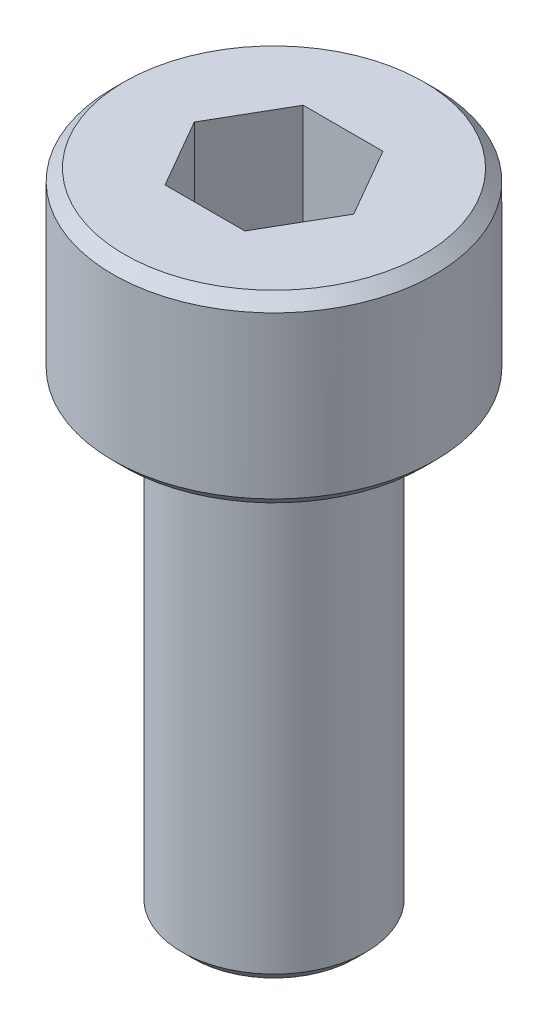
ISO-10303-21;
HEADER;
FILE_DESCRIPTION(('STEP AP214'),'2;1');
FILE_NAME('part.step','',(''),(''),'','','');
FILE_SCHEMA(('AUTOMOTIVE_DESIGN { 1 0 10303 214 1 1 1 1 }'));
ENDSEC;
DATA;
#1=APPLICATION_CONTEXT('core data for automotive mechanical design processes');
#2=APPLICATION_PROTOCOL_DEFINITION('international standard','automotive_design',2000,#1);
#3=PRODUCT_CONTEXT('',#1,'mechanical');
#4=PRODUCT('Part','Part','',(#3));
#5=PRODUCT_RELATED_PRODUCT_CATEGORY('part','',(#4));
#6=PRODUCT_DEFINITION_FORMATION('','',#4);
#7=PRODUCT_DEFINITION_CONTEXT('part definition',#1,'design');
#8=PRODUCT_DEFINITION('design','',#6,#7);
#9=PRODUCT_DEFINITION_SHAPE('','',#8);
#10=(LENGTH_UNIT() NAMED_UNIT(*) SI_UNIT(.MILLI.,.METRE.));
#11=(NAMED_UNIT(*) PLANE_ANGLE_UNIT() SI_UNIT($,.RADIAN.));
#12=(NAMED_UNIT(*) SI_UNIT($,.STERADIAN.) SOLID_ANGLE_UNIT());
#13=UNCERTAINTY_MEASURE_WITH_UNIT(LENGTH_MEASURE(1.E-05),#10,'distance_accuracy_value','');
#14=(GEOMETRIC_REPRESENTATION_CONTEXT(3) GLOBAL_UNCERTAINTY_ASSIGNED_CONTEXT((#13)) GLOBAL_UNIT_ASSIGNED_CONTEXT((#10,
#11,#12)) REPRESENTATION_CONTEXT('',''));
#15=CARTESIAN_POINT('',(0.,0.,0.));
#16=DIRECTION('',(0.,0.,1.));
#17=DIRECTION('',(1.,0.,0.));
#18=AXIS2_PLACEMENT_3D('',#15,#16,#17);
#19=CARTESIAN_POINT('',(0.,4.,0.));
#20=DIRECTION('',(0.,1.,0.));
#21=DIRECTION('',(-1.,0.,0.));
#22=AXIS2_PLACEMENT_3D('',#19,#20,#21);
#23=PLANE('',#22);
#24=CARTESIAN_POINT('',(0.,4.,0.));
#25=DIRECTION('',(0.,1.,0.));
#26=DIRECTION('',(-1.,0.,0.));
#27=AXIS2_PLACEMENT_3D('',#24,#25,#26);
#28=CIRCLE('',#27,3.25000000000001);
#29=CARTESIAN_POINT('',(-3.25,4.,0.));
#30=VERTEX_POINT('',#29);
#31=EDGE_CURVE('E11',#30,#30,#28,.T.);
#32=ORIENTED_EDGE('',*,*,#31,.T.);
#33=EDGE_LOOP('',(#32));
#34=FACE_BOUND('',#33,.T.);
#35=DIRECTION('',(-0.5,0.,-0.866025403784439));
#36=VECTOR('',#35,1.);
#37=CARTESIAN_POINT('',(1.73205080756888,4.,0.));
#38=LINE('',#37,#36);
#39=CARTESIAN_POINT('',(1.73205080756888,4.,0.));
#40=VERTEX_POINT('',#39);
#41=CARTESIAN_POINT('',(0.86602540378444,4.,-1.5));
#42=VERTEX_POINT('',#41);
#43=EDGE_CURVE('E59',#40,#42,#38,.T.);
#44=ORIENTED_EDGE('',*,*,#43,.F.);
#45=DIRECTION('',(0.5,0.,-0.866025403784439));
#46=VECTOR('',#45,1.);
#47=CARTESIAN_POINT('',(0.86602540378444,4.,1.5));
#48=LINE('',#47,#46);
#49=CARTESIAN_POINT('',(0.86602540378444,4.,1.5));
#50=VERTEX_POINT('',#49);
#51=EDGE_CURVE('E142',#50,#40,#48,.T.);
#52=ORIENTED_EDGE('',*,*,#51,.F.);
#53=DIRECTION('',(1.,0.,0.));
#54=VECTOR('',#53,1.);
#55=CARTESIAN_POINT('',(-0.866025403784436,4.,1.5));
#56=LINE('',#55,#54);
#57=CARTESIAN_POINT('',(-0.866025403784436,4.,1.5));
#58=VERTEX_POINT('',#57);
#59=EDGE_CURVE('E140',#58,#50,#56,.T.);
#60=ORIENTED_EDGE('',*,*,#59,.F.);
#61=DIRECTION('',(0.5,0.,0.866025403784438));
#62=VECTOR('',#61,1.);
#63=CARTESIAN_POINT('',(-1.73205080756888,4.,0.));
#64=LINE('',#63,#62);
#65=CARTESIAN_POINT('',(-1.73205080756888,4.,0.));
#66=VERTEX_POINT('',#65);
#67=EDGE_CURVE('E107',#66,#58,#64,.T.);
#68=ORIENTED_EDGE('',*,*,#67,.F.);
#69=DIRECTION('',(-0.5,0.,0.866025403784439));
#70=VECTOR('',#69,1.);
#71=CARTESIAN_POINT('',(-0.866025403784437,4.,-1.5));
#72=LINE('',#71,#70);
#73=CARTESIAN_POINT('',(-0.866025403784437,4.,-1.5));
#74=VERTEX_POINT('',#73);
#75=EDGE_CURVE('E136',#74,#66,#72,.T.);
#76=ORIENTED_EDGE('',*,*,#75,.F.);
#77=DIRECTION('',(-1.,0.,0.));
#78=VECTOR('',#77,1.);
#79=CARTESIAN_POINT('',(0.86602540378444,4.,-1.5));
#80=LINE('',#79,#78);
#81=EDGE_CURVE('E133',#42,#74,#80,.T.);
#82=ORIENTED_EDGE('',*,*,#81,.F.);
#83=EDGE_LOOP('',(#44,#52,#60,#68,#76,#82));
#84=FACE_BOUND('',#83,.T.);
#85=ADVANCED_FACE('F43',(#34,#84),#23,.T.);
#86=CARTESIAN_POINT('',(0.,-10.,0.));
#87=DIRECTION('',(0.,1.,0.));
#88=DIRECTION('',(-1.,0.,0.));
#89=AXIS2_PLACEMENT_3D('',#86,#87,#88);
#90=CYLINDRICAL_SURFACE('',#89,3.50000000000001);
#91=CARTESIAN_POINT('',(0.,0.25,0.));
#92=DIRECTION('',(0.,-1.,0.));
#93=DIRECTION('',(1.,0.,0.));
#94=AXIS2_PLACEMENT_3D('',#91,#92,#93);
#95=CIRCLE('',#94,3.50000000000001);
#96=CARTESIAN_POINT('',(3.50000000000001,0.249999999999999,0.));
#97=VERTEX_POINT('',#96);
#98=EDGE_CURVE('E163',#97,#97,#95,.F.);
#99=ORIENTED_EDGE('',*,*,#98,.T.);
#100=EDGE_LOOP('',(#99));
#101=FACE_BOUND('',#100,.T.);
#102=CARTESIAN_POINT('',(0.,3.75,0.));
#103=DIRECTION('',(0.,1.,0.));
#104=DIRECTION('',(-1.,0.,0.));
#105=AXIS2_PLACEMENT_3D('',#102,#103,#104);
#106=CIRCLE('',#105,3.50000000000001);
#107=CARTESIAN_POINT('',(-3.5,3.75,0.));
#108=VERTEX_POINT('',#107);
#109=EDGE_CURVE('E160',#108,#108,#106,.F.);
#110=ORIENTED_EDGE('',*,*,#109,.T.);
#111=EDGE_LOOP('',(#110));
#112=FACE_BOUND('',#111,.T.);
#113=ADVANCED_FACE('F177',(#101,#112),#90,.T.);
#114=CARTESIAN_POINT('',(-3.5,0.,0.));
#115=DIRECTION('',(0.,-1.,0.));
#116=DIRECTION('',(1.,0.,0.));
#117=AXIS2_PLACEMENT_3D('',#114,#115,#116);
#118=PLANE('',#117);
#119=CARTESIAN_POINT('',(0.,0.,0.));
#120=DIRECTION('',(0.,-1.,0.));
#121=DIRECTION('',(1.,0.,0.));
#122=AXIS2_PLACEMENT_3D('',#119,#120,#121);
#123=CIRCLE('',#122,3.25);
#124=CARTESIAN_POINT('',(3.25000000000001,0.,0.));
#125=VERTEX_POINT('',#124);
#126=EDGE_CURVE('E52',#125,#125,#123,.T.);
#127=ORIENTED_EDGE('',*,*,#126,.T.);
#128=EDGE_LOOP('',(#127));
#129=FACE_BOUND('',#128,.T.);
#130=CARTESIAN_POINT('',(0.,0.,0.));
#131=DIRECTION('',(0.,1.,0.));
#132=DIRECTION('',(-1.,0.,0.));
#133=AXIS2_PLACEMENT_3D('',#130,#131,#132);
#134=CIRCLE('',#133,2.);
#135=CARTESIAN_POINT('',(-2.,0.,0.));
#136=VERTEX_POINT('',#135);
#137=EDGE_CURVE('E146',#136,#136,#134,.T.);
#138=ORIENTED_EDGE('',*,*,#137,.T.);
#139=EDGE_LOOP('',(#138));
#140=FACE_BOUND('',#139,.T.);
#141=ADVANCED_FACE('F168',(#129,#140),#118,.T.);
#142=CARTESIAN_POINT('',(0.,-10.,0.));
#143=DIRECTION('',(0.,1.,0.));
#144=DIRECTION('',(-1.,0.,0.));
#145=AXIS2_PLACEMENT_3D('',#142,#143,#144);
#146=CYLINDRICAL_SURFACE('',#145,2.);
#147=CARTESIAN_POINT('',(0.,-9.74999999999999,0.));
#148=DIRECTION('',(0.,-1.,0.));
#149=DIRECTION('',(1.,0.,0.));
#150=AXIS2_PLACEMENT_3D('',#147,#148,#149);
#151=CIRCLE('',#150,2.);
#152=CARTESIAN_POINT('',(2.,-9.74999999999999,0.));
#153=VERTEX_POINT('',#152);
#154=EDGE_CURVE('E154',#153,#153,#151,.F.);
#155=ORIENTED_EDGE('',*,*,#154,.T.);
#156=EDGE_LOOP('',(#155));
#157=FACE_BOUND('',#156,.T.);
#158=ORIENTED_EDGE('',*,*,#137,.F.);
#159=EDGE_LOOP('',(#158));
#160=FACE_BOUND('',#159,.T.);
#161=ADVANCED_FACE('F206',(#157,#160),#146,.T.);
#162=CARTESIAN_POINT('',(-2.,-10.,0.));
#163=DIRECTION('',(0.,-1.,0.));
#164=DIRECTION('',(1.,0.,0.));
#165=AXIS2_PLACEMENT_3D('',#162,#163,#164);
#166=PLANE('',#165);
#167=CARTESIAN_POINT('',(0.,-10.,0.));
#168=DIRECTION('',(0.,-1.,0.));
#169=DIRECTION('',(1.,0.,0.));
#170=AXIS2_PLACEMENT_3D('',#167,#168,#169);
#171=CIRCLE('',#170,1.74999999999999);
#172=CARTESIAN_POINT('',(1.74999999999999,-10.,0.));
#173=VERTEX_POINT('',#172);
#174=EDGE_CURVE('E157',#173,#173,#171,.T.);
#175=ORIENTED_EDGE('',*,*,#174,.T.);
#176=EDGE_LOOP('',(#175));
#177=FACE_BOUND('',#176,.T.);
#178=ADVANCED_FACE('F199',(#177),#166,.T.);
#179=CARTESIAN_POINT('',(1.73205080756888,0.999999999999998,0.));
#180=DIRECTION('',(0.866025403784439,0.,-0.5));
#181=DIRECTION('',(-0.5,0.,-0.866025403784439));
#182=AXIS2_PLACEMENT_3D('',#179,#180,#181);
#183=PLANE('',#182);
#184=ORIENTED_EDGE('',*,*,#43,.T.);
#185=DIRECTION('',(0.,1.,0.));
#186=VECTOR('',#185,1.);
#187=CARTESIAN_POINT('',(0.866025403784439,0.999999999999999,-1.5));
#188=LINE('',#187,#186);
#189=CARTESIAN_POINT('',(0.866025403784439,0.999999999999999,-1.5));
#190=VERTEX_POINT('',#189);
#191=EDGE_CURVE('E89',#190,#42,#188,.T.);
#192=ORIENTED_EDGE('',*,*,#191,.F.);
#193=DIRECTION('',(-0.5,0.,-0.866025403784439));
#194=VECTOR('',#193,1.);
#195=CARTESIAN_POINT('',(1.73205080756888,0.999999999999998,0.));
#196=LINE('',#195,#194);
#197=CARTESIAN_POINT('',(1.73205080756888,0.999999999999998,0.));
#198=VERTEX_POINT('',#197);
#199=EDGE_CURVE('E144',#198,#190,#196,.T.);
#200=ORIENTED_EDGE('',*,*,#199,.F.);
#201=DIRECTION('',(0.,1.,0.));
#202=VECTOR('',#201,1.);
#203=CARTESIAN_POINT('',(1.73205080756888,0.999999999999998,0.));
#204=LINE('',#203,#202);
#205=EDGE_CURVE('E67',#198,#40,#204,.T.);
#206=ORIENTED_EDGE('',*,*,#205,.T.);
#207=EDGE_LOOP('',(#184,#192,#200,#206));
#208=FACE_BOUND('',#207,.T.);
#209=ADVANCED_FACE('F196',(#208),#183,.F.);
#210=CARTESIAN_POINT('',(0.866025403784439,0.999999999999999,1.5));
#211=DIRECTION('',(0.866025403784439,0.,0.5));
#212=DIRECTION('',(0.5,0.,-0.866025403784439));
#213=AXIS2_PLACEMENT_3D('',#210,#211,#212);
#214=PLANE('',#213);
#215=ORIENTED_EDGE('',*,*,#51,.T.);
#216=ORIENTED_EDGE('',*,*,#205,.F.);
#217=DIRECTION('',(0.5,0.,-0.866025403784439));
#218=VECTOR('',#217,1.);
#219=CARTESIAN_POINT('',(0.866025403784439,0.999999999999999,1.5));
#220=LINE('',#219,#218);
#221=CARTESIAN_POINT('',(0.866025403784439,0.999999999999999,1.5));
#222=VERTEX_POINT('',#221);
#223=EDGE_CURVE('E119',#222,#198,#220,.T.);
#224=ORIENTED_EDGE('',*,*,#223,.F.);
#225=DIRECTION('',(0.,1.,0.));
#226=VECTOR('',#225,1.);
#227=CARTESIAN_POINT('',(0.866025403784439,0.999999999999999,1.5));
#228=LINE('',#227,#226);
#229=EDGE_CURVE('E111',#222,#50,#228,.T.);
#230=ORIENTED_EDGE('',*,*,#229,.T.);
#231=EDGE_LOOP('',(#215,#216,#224,#230));
#232=FACE_BOUND('',#231,.T.);
#233=ADVANCED_FACE('F198',(#232),#214,.F.);
#234=CARTESIAN_POINT('',(-0.866025403784437,0.999999999999999,1.5));
#235=DIRECTION('',(0.,0.,1.));
#236=DIRECTION('',(1.,0.,0.));
#237=AXIS2_PLACEMENT_3D('',#234,#235,#236);
#238=PLANE('',#237);
#239=ORIENTED_EDGE('',*,*,#59,.T.);
#240=ORIENTED_EDGE('',*,*,#229,.F.);
#241=DIRECTION('',(1.,0.,0.));
#242=VECTOR('',#241,1.);
#243=CARTESIAN_POINT('',(-0.866025403784437,0.999999999999999,1.5));
#244=LINE('',#243,#242);
#245=CARTESIAN_POINT('',(-0.866025403784437,0.999999999999999,1.5));
#246=VERTEX_POINT('',#245);
#247=EDGE_CURVE('E115',#246,#222,#244,.T.);
#248=ORIENTED_EDGE('',*,*,#247,.F.);
#249=DIRECTION('',(0.,1.,0.));
#250=VECTOR('',#249,1.);
#251=CARTESIAN_POINT('',(-0.866025403784437,0.999999999999999,1.5));
#252=LINE('',#251,#250);
#253=EDGE_CURVE('E100',#246,#58,#252,.T.);
#254=ORIENTED_EDGE('',*,*,#253,.T.);
#255=EDGE_LOOP('',(#239,#240,#248,#254));
#256=FACE_BOUND('',#255,.T.);
#257=ADVANCED_FACE('F116',(#256),#238,.F.);
#258=CARTESIAN_POINT('',(-1.73205080756888,1.,0.));
#259=DIRECTION('',(-0.866025403784438,0.,0.5));
#260=DIRECTION('',(0.5,0.,0.866025403784438));
#261=AXIS2_PLACEMENT_3D('',#258,#259,#260);
#262=PLANE('',#261);
#263=ORIENTED_EDGE('',*,*,#67,.T.);
#264=ORIENTED_EDGE('',*,*,#253,.F.);
#265=DIRECTION('',(0.5,0.,0.866025403784438));
#266=VECTOR('',#265,1.);
#267=CARTESIAN_POINT('',(-1.73205080756888,1.,0.));
#268=LINE('',#267,#266);
#269=CARTESIAN_POINT('',(-1.73205080756888,1.,0.));
#270=VERTEX_POINT('',#269);
#271=EDGE_CURVE('E104',#270,#246,#268,.T.);
#272=ORIENTED_EDGE('',*,*,#271,.F.);
#273=DIRECTION('',(0.,1.,0.));
#274=VECTOR('',#273,1.);
#275=CARTESIAN_POINT('',(-1.73205080756888,1.,0.));
#276=LINE('',#275,#274);
#277=EDGE_CURVE('E112',#270,#66,#276,.T.);
#278=ORIENTED_EDGE('',*,*,#277,.T.);
#279=EDGE_LOOP('',(#263,#264,#272,#278));
#280=FACE_BOUND('',#279,.T.);
#281=ADVANCED_FACE('F102',(#280),#262,.F.);
#282=CARTESIAN_POINT('',(-0.866025403784438,0.999999999999999,-1.5));
#283=DIRECTION('',(-0.866025403784439,0.,-0.5));
#284=DIRECTION('',(-0.5,0.,0.866025403784439));
#285=AXIS2_PLACEMENT_3D('',#282,#283,#284);
#286=PLANE('',#285);
#287=ORIENTED_EDGE('',*,*,#75,.T.);
#288=ORIENTED_EDGE('',*,*,#277,.F.);
#289=DIRECTION('',(-0.5,0.,0.866025403784439));
#290=VECTOR('',#289,1.);
#291=CARTESIAN_POINT('',(-0.866025403784438,0.999999999999999,-1.5));
#292=LINE('',#291,#290);
#293=CARTESIAN_POINT('',(-0.866025403784438,0.999999999999999,-1.5));
#294=VERTEX_POINT('',#293);
#295=EDGE_CURVE('E125',#294,#270,#292,.T.);
#296=ORIENTED_EDGE('',*,*,#295,.F.);
#297=DIRECTION('',(0.,1.,0.));
#298=VECTOR('',#297,1.);
#299=CARTESIAN_POINT('',(-0.866025403784438,0.999999999999999,-1.5));
#300=LINE('',#299,#298);
#301=EDGE_CURVE('E149',#294,#74,#300,.T.);
#302=ORIENTED_EDGE('',*,*,#301,.T.);
#303=EDGE_LOOP('',(#287,#288,#296,#302));
#304=FACE_BOUND('',#303,.T.);
#305=ADVANCED_FACE('F239',(#304),#286,.F.);
#306=CARTESIAN_POINT('',(0.866025403784439,0.999999999999999,-1.5));
#307=DIRECTION('',(0.,0.,-1.));
#308=DIRECTION('',(-1.,0.,0.));
#309=AXIS2_PLACEMENT_3D('',#306,#307,#308);
#310=PLANE('',#309);
#311=ORIENTED_EDGE('',*,*,#81,.T.);
#312=ORIENTED_EDGE('',*,*,#301,.F.);
#313=DIRECTION('',(-1.,0.,0.));
#314=VECTOR('',#313,1.);
#315=CARTESIAN_POINT('',(0.866025403784439,0.999999999999999,-1.5));
#316=LINE('',#315,#314);
#317=EDGE_CURVE('E127',#190,#294,#316,.T.);
#318=ORIENTED_EDGE('',*,*,#317,.F.);
#319=ORIENTED_EDGE('',*,*,#191,.T.);
#320=EDGE_LOOP('',(#311,#312,#318,#319));
#321=FACE_BOUND('',#320,.T.);
#322=ADVANCED_FACE('F194',(#321),#310,.F.);
#323=CARTESIAN_POINT('',(0.,0.999999999999998,0.));
#324=DIRECTION('',(0.,1.,0.));
#325=DIRECTION('',(0.,0.,1.));
#326=AXIS2_PLACEMENT_3D('',#323,#324,#325);
#327=PLANE('',#326);
#328=ORIENTED_EDGE('',*,*,#199,.T.);
#329=ORIENTED_EDGE('',*,*,#317,.T.);
#330=ORIENTED_EDGE('',*,*,#295,.T.);
#331=ORIENTED_EDGE('',*,*,#271,.T.);
#332=ORIENTED_EDGE('',*,*,#247,.T.);
#333=ORIENTED_EDGE('',*,*,#223,.T.);
#334=EDGE_LOOP('',(#328,#329,#330,#331,#332,#333));
#335=FACE_BOUND('',#334,.T.);
#336=ADVANCED_FACE('F122',(#335),#327,.T.);
#337=CARTESIAN_POINT('',(0.,-9.74999999999999,0.));
#338=DIRECTION('',(0.,1.,0.));
#339=DIRECTION('',(-1.,0.,0.));
#340=AXIS2_PLACEMENT_3D('',#337,#338,#339);
#341=CONICAL_SURFACE('',#340,2.,0.78539816339745);
#342=ORIENTED_EDGE('',*,*,#174,.F.);
#343=EDGE_LOOP('',(#342));
#344=FACE_BOUND('',#343,.T.);
#345=ORIENTED_EDGE('',*,*,#154,.F.);
#346=EDGE_LOOP('',(#345));
#347=FACE_BOUND('',#346,.T.);
#348=ADVANCED_FACE('F174',(#344,#347),#341,.T.);
#349=CARTESIAN_POINT('',(0.,0.25,0.));
#350=DIRECTION('',(0.,1.,0.));
#351=DIRECTION('',(-1.,0.,0.));
#352=AXIS2_PLACEMENT_3D('',#349,#350,#351);
#353=CONICAL_SURFACE('',#352,3.50000000000001,0.785398163397448);
#354=ORIENTED_EDGE('',*,*,#126,.F.);
#355=EDGE_LOOP('',(#354));
#356=FACE_BOUND('',#355,.T.);
#357=ORIENTED_EDGE('',*,*,#98,.F.);
#358=EDGE_LOOP('',(#357));
#359=FACE_BOUND('',#358,.T.);
#360=ADVANCED_FACE('F171',(#356,#359),#353,.T.);
#361=CARTESIAN_POINT('',(0.,4.,0.));
#362=DIRECTION('',(0.,-1.,0.));
#363=DIRECTION('',(1.,0.,0.));
#364=AXIS2_PLACEMENT_3D('',#361,#362,#363);
#365=CONICAL_SURFACE('',#364,3.25000000000001,0.785398163397449);
#366=ORIENTED_EDGE('',*,*,#109,.F.);
#367=EDGE_LOOP('',(#366));
#368=FACE_BOUND('',#367,.T.);
#369=ORIENTED_EDGE('',*,*,#31,.F.);
#370=EDGE_LOOP('',(#369));
#371=FACE_BOUND('',#370,.T.);
#372=ADVANCED_FACE('F46',(#368,#371),#365,.T.);
#373=CLOSED_SHELL('',(#85,#113,#141,#161,#178,#209,#233,#257,#281,#305,#322,#336,#348,#360,#372));
#374=MANIFOLD_SOLID_BREP('B2',#373);
#375=ADVANCED_BREP_SHAPE_REPRESENTATION('',(#18,#374),#14);
#376=SHAPE_DEFINITION_REPRESENTATION(#9,#375);
ENDSEC;
END-ISO-10303-21;
